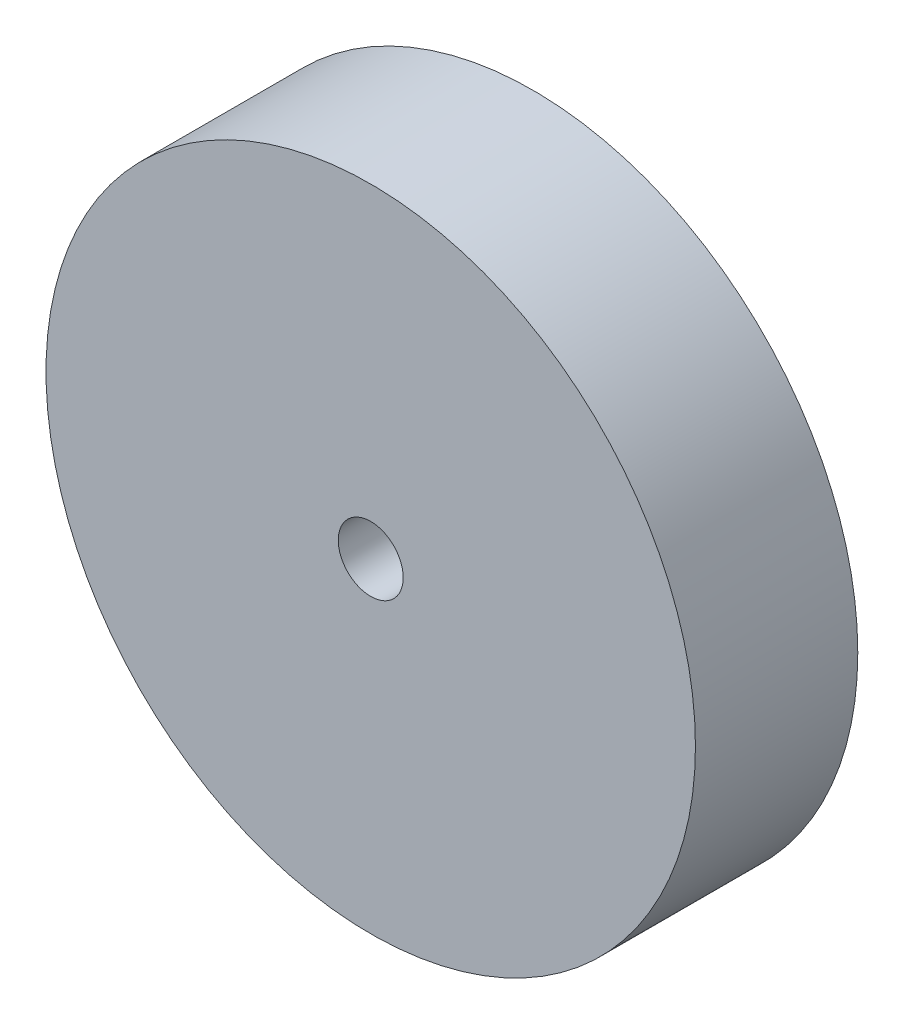
ISO-10303-21;
HEADER;
FILE_DESCRIPTION(('STEP AP214'),'2;1');
FILE_NAME('part.step','',(''),(''),'','','');
FILE_SCHEMA(('AUTOMOTIVE_DESIGN { 1 0 10303 214 1 1 1 1 }'));
ENDSEC;
DATA;
#1=APPLICATION_CONTEXT('core data for automotive mechanical design processes');
#2=APPLICATION_PROTOCOL_DEFINITION('international standard','automotive_design',2000,#1);
#3=PRODUCT_CONTEXT('',#1,'mechanical');
#4=PRODUCT('Part','Part','',(#3));
#5=PRODUCT_RELATED_PRODUCT_CATEGORY('part','',(#4));
#6=PRODUCT_DEFINITION_FORMATION('','',#4);
#7=PRODUCT_DEFINITION_CONTEXT('part definition',#1,'design');
#8=PRODUCT_DEFINITION('design','',#6,#7);
#9=PRODUCT_DEFINITION_SHAPE('','',#8);
#10=(LENGTH_UNIT() NAMED_UNIT(*) SI_UNIT(.MILLI.,.METRE.));
#11=(NAMED_UNIT(*) PLANE_ANGLE_UNIT() SI_UNIT($,.RADIAN.));
#12=(NAMED_UNIT(*) SI_UNIT($,.STERADIAN.) SOLID_ANGLE_UNIT());
#13=UNCERTAINTY_MEASURE_WITH_UNIT(LENGTH_MEASURE(1.E-05),#10,'distance_accuracy_value','');
#14=(GEOMETRIC_REPRESENTATION_CONTEXT(3) GLOBAL_UNCERTAINTY_ASSIGNED_CONTEXT((#13)) GLOBAL_UNIT_ASSIGNED_CONTEXT((#10,
#11,#12)) REPRESENTATION_CONTEXT('',''));
#15=CARTESIAN_POINT('',(0.,0.,0.));
#16=DIRECTION('',(0.,0.,1.));
#17=DIRECTION('',(1.,0.,0.));
#18=AXIS2_PLACEMENT_3D('',#15,#16,#17);
#19=CARTESIAN_POINT('',(0.,0.,50.));
#20=DIRECTION('',(0.,0.,-1.));
#21=DIRECTION('',(-1.,0.,0.));
#22=AXIS2_PLACEMENT_3D('',#19,#20,#21);
#23=CYLINDRICAL_SURFACE('',#22,100.);
#24=CARTESIAN_POINT('',(0.,0.,50.));
#25=DIRECTION('',(0.,0.,1.));
#26=DIRECTION('',(1.,0.,0.));
#27=AXIS2_PLACEMENT_3D('',#24,#25,#26);
#28=CIRCLE('',#27,100.);
#29=CARTESIAN_POINT('',(100.,0.,50.));
#30=VERTEX_POINT('',#29);
#31=EDGE_CURVE('E10',#30,#30,#28,.T.);
#32=ORIENTED_EDGE('',*,*,#31,.F.);
#33=EDGE_LOOP('',(#32));
#34=FACE_BOUND('',#33,.T.);
#35=CARTESIAN_POINT('',(0.,0.,0.));
#36=DIRECTION('',(0.,0.,1.));
#37=DIRECTION('',(1.,0.,0.));
#38=AXIS2_PLACEMENT_3D('',#35,#36,#37);
#39=CIRCLE('',#38,100.);
#40=CARTESIAN_POINT('',(100.,0.,0.));
#41=VERTEX_POINT('',#40);
#42=EDGE_CURVE('E37',#41,#41,#39,.T.);
#43=ORIENTED_EDGE('',*,*,#42,.T.);
#44=EDGE_LOOP('',(#43));
#45=FACE_BOUND('',#44,.T.);
#46=ADVANCED_FACE('F40',(#34,#45),#23,.T.);
#47=CARTESIAN_POINT('',(0.,0.,50.));
#48=DIRECTION('',(0.,0.,1.));
#49=DIRECTION('',(1.,0.,0.));
#50=AXIS2_PLACEMENT_3D('',#47,#48,#49);
#51=PLANE('',#50);
#52=CARTESIAN_POINT('',(0.,0.,50.));
#53=DIRECTION('',(0.,0.,1.));
#54=DIRECTION('',(1.,0.,0.));
#55=AXIS2_PLACEMENT_3D('',#52,#53,#54);
#56=CIRCLE('',#55,10.);
#57=CARTESIAN_POINT('',(10.,0.,50.));
#58=VERTEX_POINT('',#57);
#59=EDGE_CURVE('E50',#58,#58,#56,.T.);
#60=ORIENTED_EDGE('',*,*,#59,.F.);
#61=EDGE_LOOP('',(#60));
#62=FACE_BOUND('',#61,.T.);
#63=ORIENTED_EDGE('',*,*,#31,.T.);
#64=EDGE_LOOP('',(#63));
#65=FACE_BOUND('',#64,.T.);
#66=ADVANCED_FACE('F59',(#62,#65),#51,.T.);
#67=CARTESIAN_POINT('',(0.,0.,0.));
#68=DIRECTION('',(0.,0.,1.));
#69=DIRECTION('',(1.,0.,0.));
#70=AXIS2_PLACEMENT_3D('',#67,#68,#69);
#71=PLANE('',#70);
#72=CARTESIAN_POINT('',(0.,0.,0.));
#73=DIRECTION('',(0.,0.,1.));
#74=DIRECTION('',(1.,0.,0.));
#75=AXIS2_PLACEMENT_3D('',#72,#73,#74);
#76=CIRCLE('',#75,10.);
#77=CARTESIAN_POINT('',(10.,0.,0.));
#78=VERTEX_POINT('',#77);
#79=EDGE_CURVE('E47',#78,#78,#76,.T.);
#80=ORIENTED_EDGE('',*,*,#79,.T.);
#81=EDGE_LOOP('',(#80));
#82=FACE_BOUND('',#81,.T.);
#83=ORIENTED_EDGE('',*,*,#42,.F.);
#84=EDGE_LOOP('',(#83));
#85=FACE_BOUND('',#84,.T.);
#86=ADVANCED_FACE('F58',(#82,#85),#71,.F.);
#87=CARTESIAN_POINT('',(0.,0.,50.));
#88=DIRECTION('',(0.,0.,-1.));
#89=DIRECTION('',(-1.,0.,0.));
#90=AXIS2_PLACEMENT_3D('',#87,#88,#89);
#91=CYLINDRICAL_SURFACE('',#90,10.);
#92=ORIENTED_EDGE('',*,*,#59,.T.);
#93=EDGE_LOOP('',(#92));
#94=FACE_BOUND('',#93,.T.);
#95=ORIENTED_EDGE('',*,*,#79,.F.);
#96=EDGE_LOOP('',(#95));
#97=FACE_BOUND('',#96,.T.);
#98=ADVANCED_FACE('F54',(#94,#97),#91,.F.);
#99=CLOSED_SHELL('',(#46,#66,#86,#98));
#100=MANIFOLD_SOLID_BREP('B2',#99);
#101=ADVANCED_BREP_SHAPE_REPRESENTATION('',(#18,#100),#14);
#102=SHAPE_DEFINITION_REPRESENTATION(#9,#101);
ENDSEC;
END-ISO-10303-21;
